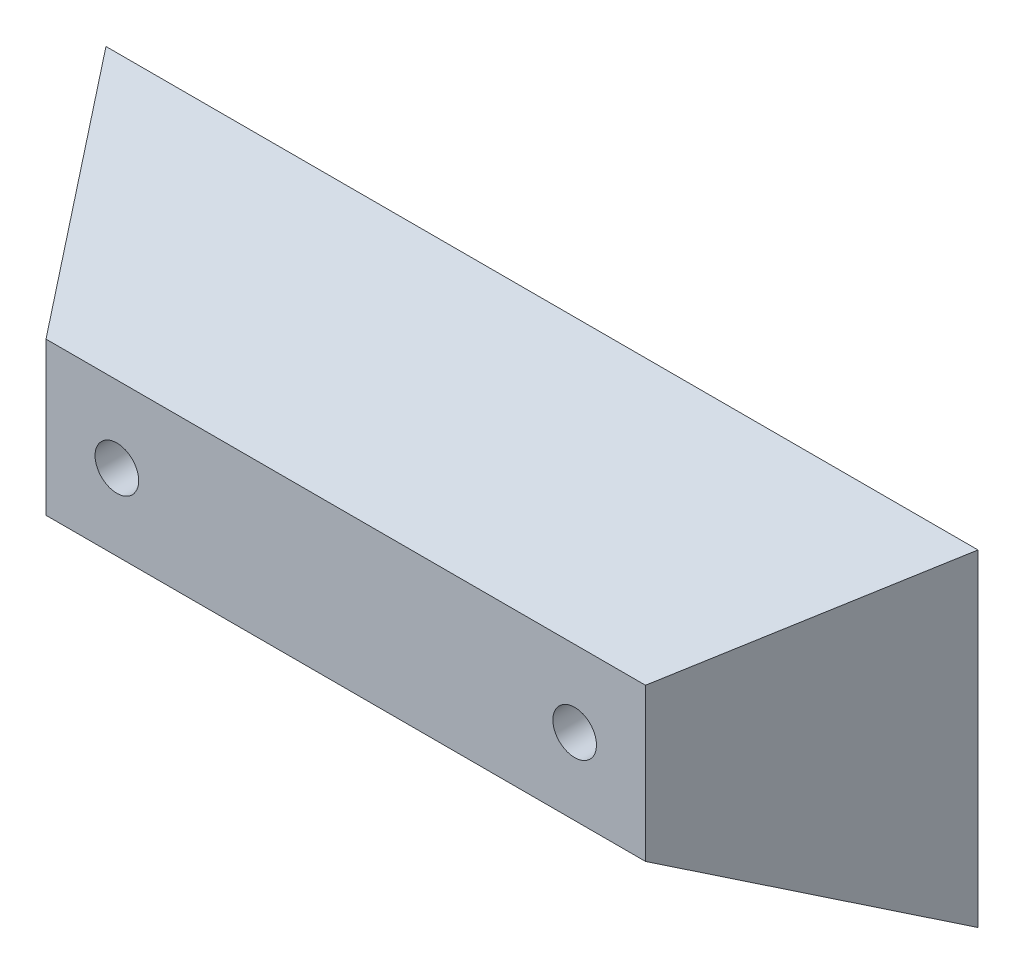
ISO-10303-21;
HEADER;
FILE_DESCRIPTION(('STEP AP214'),'2;1');
FILE_NAME('part.step','',(''),(''),'','','');
FILE_SCHEMA(('AUTOMOTIVE_DESIGN { 1 0 10303 214 1 1 1 1 }'));
ENDSEC;
DATA;
#1=APPLICATION_CONTEXT('core data for automotive mechanical design processes');
#2=APPLICATION_PROTOCOL_DEFINITION('international standard','automotive_design',2000,#1);
#3=PRODUCT_CONTEXT('',#1,'mechanical');
#4=PRODUCT('Part','Part','',(#3));
#5=PRODUCT_RELATED_PRODUCT_CATEGORY('part','',(#4));
#6=PRODUCT_DEFINITION_FORMATION('','',#4);
#7=PRODUCT_DEFINITION_CONTEXT('part definition',#1,'design');
#8=PRODUCT_DEFINITION('design','',#6,#7);
#9=PRODUCT_DEFINITION_SHAPE('','',#8);
#10=(LENGTH_UNIT() NAMED_UNIT(*) SI_UNIT(.MILLI.,.METRE.));
#11=(NAMED_UNIT(*) PLANE_ANGLE_UNIT() SI_UNIT($,.RADIAN.));
#12=(NAMED_UNIT(*) SI_UNIT($,.STERADIAN.) SOLID_ANGLE_UNIT());
#13=UNCERTAINTY_MEASURE_WITH_UNIT(LENGTH_MEASURE(1.E-05),#10,'distance_accuracy_value','');
#14=(GEOMETRIC_REPRESENTATION_CONTEXT(3) GLOBAL_UNCERTAINTY_ASSIGNED_CONTEXT((#13)) GLOBAL_UNIT_ASSIGNED_CONTEXT((#10,
#11,#12)) REPRESENTATION_CONTEXT('',''));
#15=CARTESIAN_POINT('',(0.,0.,0.));
#16=DIRECTION('',(0.,0.,1.));
#17=DIRECTION('',(1.,0.,0.));
#18=AXIS2_PLACEMENT_3D('',#15,#16,#17);
#19=CARTESIAN_POINT('',(40.,30.,0.));
#20=DIRECTION('',(0.,0.,1.));
#21=DIRECTION('',(1.,0.,0.));
#22=AXIS2_PLACEMENT_3D('',#19,#20,#21);
#23=PLANE('',#22);
#24=CARTESIAN_POINT('',(21.,15.,0.));
#25=DIRECTION('',(0.,0.,-1.));
#26=DIRECTION('',(-1.,0.,0.));
#27=AXIS2_PLACEMENT_3D('',#24,#25,#26);
#28=CIRCLE('',#27,2.);
#29=CARTESIAN_POINT('',(19.,15.,0.));
#30=VERTEX_POINT('',#29);
#31=EDGE_CURVE('E162',#30,#30,#28,.T.);
#32=ORIENTED_EDGE('',*,*,#31,.F.);
#33=EDGE_LOOP('',(#32));
#34=FACE_BOUND('',#33,.T.);
#35=CARTESIAN_POINT('',(-21.,15.,0.));
#36=DIRECTION('',(0.,0.,-1.));
#37=DIRECTION('',(-1.,0.,0.));
#38=AXIS2_PLACEMENT_3D('',#35,#36,#37);
#39=CIRCLE('',#38,2.00000000000001);
#40=CARTESIAN_POINT('',(-23.,15.,0.));
#41=VERTEX_POINT('',#40);
#42=EDGE_CURVE('E169',#41,#41,#39,.T.);
#43=ORIENTED_EDGE('',*,*,#42,.F.);
#44=EDGE_LOOP('',(#43));
#45=FACE_BOUND('',#44,.T.);
#46=DIRECTION('',(-1.,0.,0.));
#47=VECTOR('',#46,1.);
#48=CARTESIAN_POINT('',(40.,0.,0.));
#49=LINE('',#48,#47);
#50=CARTESIAN_POINT('',(40.,0.,0.));
#51=VERTEX_POINT('',#50);
#52=CARTESIAN_POINT('',(-40.,0.,0.));
#53=VERTEX_POINT('',#52);
#54=EDGE_CURVE('E91',#51,#53,#49,.T.);
#55=ORIENTED_EDGE('',*,*,#54,.T.);
#56=DIRECTION('',(0.,-1.,0.));
#57=VECTOR('',#56,1.);
#58=CARTESIAN_POINT('',(-40.,30.,0.));
#59=LINE('',#58,#57);
#60=CARTESIAN_POINT('',(-40.,30.,0.));
#61=VERTEX_POINT('',#60);
#62=EDGE_CURVE('E81',#61,#53,#59,.T.);
#63=ORIENTED_EDGE('',*,*,#62,.F.);
#64=DIRECTION('',(-1.,0.,0.));
#65=VECTOR('',#64,1.);
#66=CARTESIAN_POINT('',(40.,30.,0.));
#67=LINE('',#66,#65);
#68=CARTESIAN_POINT('',(40.,30.,0.));
#69=VERTEX_POINT('',#68);
#70=EDGE_CURVE('E89',#69,#61,#67,.T.);
#71=ORIENTED_EDGE('',*,*,#70,.F.);
#72=DIRECTION('',(0.,-1.,0.));
#73=VECTOR('',#72,1.);
#74=CARTESIAN_POINT('',(40.,30.,0.));
#75=LINE('',#74,#73);
#76=EDGE_CURVE('E97',#69,#51,#75,.T.);
#77=ORIENTED_EDGE('',*,*,#76,.T.);
#78=EDGE_LOOP('',(#55,#63,#71,#77));
#79=FACE_BOUND('',#78,.T.);
#80=ADVANCED_FACE('F39',(#34,#45,#79),#23,.F.);
#81=CARTESIAN_POINT('',(-40.,30.,0.));
#82=DIRECTION('',(0.821369965673296,0.,-0.570395809495344));
#83=DIRECTION('',(-0.570395809495344,0.,-0.821369965673296));
#84=AXIS2_PLACEMENT_3D('',#81,#82,#83);
#85=PLANE('',#84);
#86=DIRECTION('',(0.,-1.,0.));
#87=VECTOR('',#86,1.);
#88=CARTESIAN_POINT('',(-27.5,30.,18.));
#89=LINE('',#88,#87);
#90=CARTESIAN_POINT('',(-27.5,22.,18.));
#91=VERTEX_POINT('',#90);
#92=CARTESIAN_POINT('',(-27.5,8.00000000000001,18.));
#93=VERTEX_POINT('',#92);
#94=EDGE_CURVE('E83',#91,#93,#89,.T.);
#95=ORIENTED_EDGE('',*,*,#94,.F.);
#96=DIRECTION('',(-0.53580997461131,0.342918383751236,-0.771566363440286));
#97=VECTOR('',#96,1.);
#98=CARTESIAN_POINT('',(-28.5163068442812,22.6504363803399,16.5365181442351));
#99=LINE('',#98,#97);
#100=EDGE_CURVE('E11',#91,#61,#99,.T.);
#101=ORIENTED_EDGE('',*,*,#100,.T.);
#102=ORIENTED_EDGE('',*,*,#62,.T.);
#103=DIRECTION('',(-0.53580997461131,-0.342918383751236,-0.771566363440286));
#104=VECTOR('',#103,1.);
#105=CARTESIAN_POINT('',(-27.5,8.00000000000001,18.));
#106=LINE('',#105,#104);
#107=EDGE_CURVE('E119',#53,#93,#106,.F.);
#108=ORIENTED_EDGE('',*,*,#107,.T.);
#109=EDGE_LOOP('',(#95,#101,#102,#108));
#110=FACE_BOUND('',#109,.T.);
#111=ADVANCED_FACE('F79',(#110),#85,.F.);
#112=CARTESIAN_POINT('',(-27.5,30.,18.));
#113=DIRECTION('',(0.,0.,-1.));
#114=DIRECTION('',(-1.,0.,0.));
#115=AXIS2_PLACEMENT_3D('',#112,#113,#114);
#116=PLANE('',#115);
#117=CARTESIAN_POINT('',(21.,15.,18.));
#118=DIRECTION('',(0.,0.,-1.));
#119=DIRECTION('',(-1.,0.,0.));
#120=AXIS2_PLACEMENT_3D('',#117,#118,#119);
#121=CIRCLE('',#120,2.);
#122=CARTESIAN_POINT('',(19.,15.,18.));
#123=VERTEX_POINT('',#122);
#124=EDGE_CURVE('E103',#123,#123,#121,.F.);
#125=ORIENTED_EDGE('',*,*,#124,.F.);
#126=EDGE_LOOP('',(#125));
#127=FACE_BOUND('',#126,.T.);
#128=CARTESIAN_POINT('',(-21.,15.,18.));
#129=DIRECTION('',(0.,0.,-1.));
#130=DIRECTION('',(-1.,0.,0.));
#131=AXIS2_PLACEMENT_3D('',#128,#129,#130);
#132=CIRCLE('',#131,2.00000000000001);
#133=CARTESIAN_POINT('',(-23.,15.,18.));
#134=VERTEX_POINT('',#133);
#135=EDGE_CURVE('E106',#134,#134,#132,.F.);
#136=ORIENTED_EDGE('',*,*,#135,.F.);
#137=EDGE_LOOP('',(#136));
#138=FACE_BOUND('',#137,.T.);
#139=DIRECTION('',(0.,-1.,0.));
#140=VECTOR('',#139,1.);
#141=CARTESIAN_POINT('',(27.5,30.,18.));
#142=LINE('',#141,#140);
#143=CARTESIAN_POINT('',(27.5,22.,18.));
#144=VERTEX_POINT('',#143);
#145=CARTESIAN_POINT('',(27.5,8.00000000000001,18.));
#146=VERTEX_POINT('',#145);
#147=EDGE_CURVE('E101',#144,#146,#142,.T.);
#148=ORIENTED_EDGE('',*,*,#147,.F.);
#149=DIRECTION('',(-1.,0.,0.));
#150=VECTOR('',#149,1.);
#151=CARTESIAN_POINT('',(-27.5,22.,18.));
#152=LINE('',#151,#150);
#153=EDGE_CURVE('E48',#144,#91,#152,.T.);
#154=ORIENTED_EDGE('',*,*,#153,.T.);
#155=ORIENTED_EDGE('',*,*,#94,.T.);
#156=DIRECTION('',(1.,0.,0.));
#157=VECTOR('',#156,1.);
#158=CARTESIAN_POINT('',(-27.5,8.00000000000001,18.));
#159=LINE('',#158,#157);
#160=EDGE_CURVE('E94',#93,#146,#159,.T.);
#161=ORIENTED_EDGE('',*,*,#160,.T.);
#162=EDGE_LOOP('',(#148,#154,#155,#161));
#163=FACE_BOUND('',#162,.T.);
#164=ADVANCED_FACE('F128',(#127,#138,#163),#116,.F.);
#165=CARTESIAN_POINT('',(27.5,30.,18.));
#166=DIRECTION('',(-0.821369965673296,0.,-0.570395809495344));
#167=DIRECTION('',(-0.570395809495344,0.,0.821369965673296));
#168=AXIS2_PLACEMENT_3D('',#165,#166,#167);
#169=PLANE('',#168);
#170=ORIENTED_EDGE('',*,*,#76,.F.);
#171=DIRECTION('',(-0.53580997461131,-0.342918383751236,0.771566363440286));
#172=VECTOR('',#171,1.);
#173=CARTESIAN_POINT('',(28.5163068442812,22.6504363803399,16.5365181442351));
#174=LINE('',#173,#172);
#175=EDGE_CURVE('E62',#69,#144,#174,.T.);
#176=ORIENTED_EDGE('',*,*,#175,.T.);
#177=ORIENTED_EDGE('',*,*,#147,.T.);
#178=DIRECTION('',(-0.53580997461131,0.342918383751236,0.771566363440286));
#179=VECTOR('',#178,1.);
#180=CARTESIAN_POINT('',(11.7099219108865,18.1056499770326,40.7377124483234));
#181=LINE('',#180,#179);
#182=EDGE_CURVE('E116',#146,#51,#181,.F.);
#183=ORIENTED_EDGE('',*,*,#182,.T.);
#184=EDGE_LOOP('',(#170,#176,#177,#183));
#185=FACE_BOUND('',#184,.T.);
#186=ADVANCED_FACE('F129',(#185),#169,.F.);
#187=CARTESIAN_POINT('',(-21.,15.,18.001));
#188=DIRECTION('',(0.,0.,-1.));
#189=DIRECTION('',(-1.,0.,0.));
#190=AXIS2_PLACEMENT_3D('',#187,#188,#189);
#191=CYLINDRICAL_SURFACE('',#190,2.00000000000001);
#192=ORIENTED_EDGE('',*,*,#42,.T.);
#193=EDGE_LOOP('',(#192));
#194=FACE_BOUND('',#193,.T.);
#195=ORIENTED_EDGE('',*,*,#135,.T.);
#196=EDGE_LOOP('',(#195));
#197=FACE_BOUND('',#196,.T.);
#198=ADVANCED_FACE('F131',(#194,#197),#191,.F.);
#199=CARTESIAN_POINT('',(21.,15.,18.001));
#200=DIRECTION('',(0.,0.,-1.));
#201=DIRECTION('',(-1.,0.,0.));
#202=AXIS2_PLACEMENT_3D('',#199,#200,#201);
#203=CYLINDRICAL_SURFACE('',#202,2.);
#204=ORIENTED_EDGE('',*,*,#31,.T.);
#205=EDGE_LOOP('',(#204));
#206=FACE_BOUND('',#205,.T.);
#207=ORIENTED_EDGE('',*,*,#124,.T.);
#208=EDGE_LOOP('',(#207));
#209=FACE_BOUND('',#208,.T.);
#210=ADVANCED_FACE('F137',(#206,#209),#203,.F.);
#211=CARTESIAN_POINT('',(-27.5,8.00000000000001,18.));
#212=DIRECTION('',(0.,0.913811548620258,-0.406138466053445));
#213=DIRECTION('',(1.,0.,0.));
#214=AXIS2_PLACEMENT_3D('',#211,#212,#213);
#215=PLANE('',#214);
#216=ORIENTED_EDGE('',*,*,#107,.F.);
#217=ORIENTED_EDGE('',*,*,#54,.F.);
#218=ORIENTED_EDGE('',*,*,#182,.F.);
#219=ORIENTED_EDGE('',*,*,#160,.F.);
#220=EDGE_LOOP('',(#216,#217,#218,#219));
#221=FACE_BOUND('',#220,.T.);
#222=ADVANCED_FACE('F127',(#221),#215,.F.);
#223=CARTESIAN_POINT('',(0.,30.,-1.38777878078145E-13));
#224=DIRECTION('',(0.,0.913811548620258,0.406138466053445));
#225=DIRECTION('',(-1.,0.,0.));
#226=AXIS2_PLACEMENT_3D('',#223,#224,#225);
#227=PLANE('',#226);
#228=ORIENTED_EDGE('',*,*,#100,.F.);
#229=ORIENTED_EDGE('',*,*,#153,.F.);
#230=ORIENTED_EDGE('',*,*,#175,.F.);
#231=ORIENTED_EDGE('',*,*,#70,.T.);
#232=EDGE_LOOP('',(#228,#229,#230,#231));
#233=FACE_BOUND('',#232,.T.);
#234=ADVANCED_FACE('F41',(#233),#227,.T.);
#235=CLOSED_SHELL('',(#80,#111,#164,#186,#198,#210,#222,#234));
#236=MANIFOLD_SOLID_BREP('B2',#235);
#237=ADVANCED_BREP_SHAPE_REPRESENTATION('',(#18,#236),#14);
#238=SHAPE_DEFINITION_REPRESENTATION(#9,#237);
ENDSEC;
END-ISO-10303-21;
